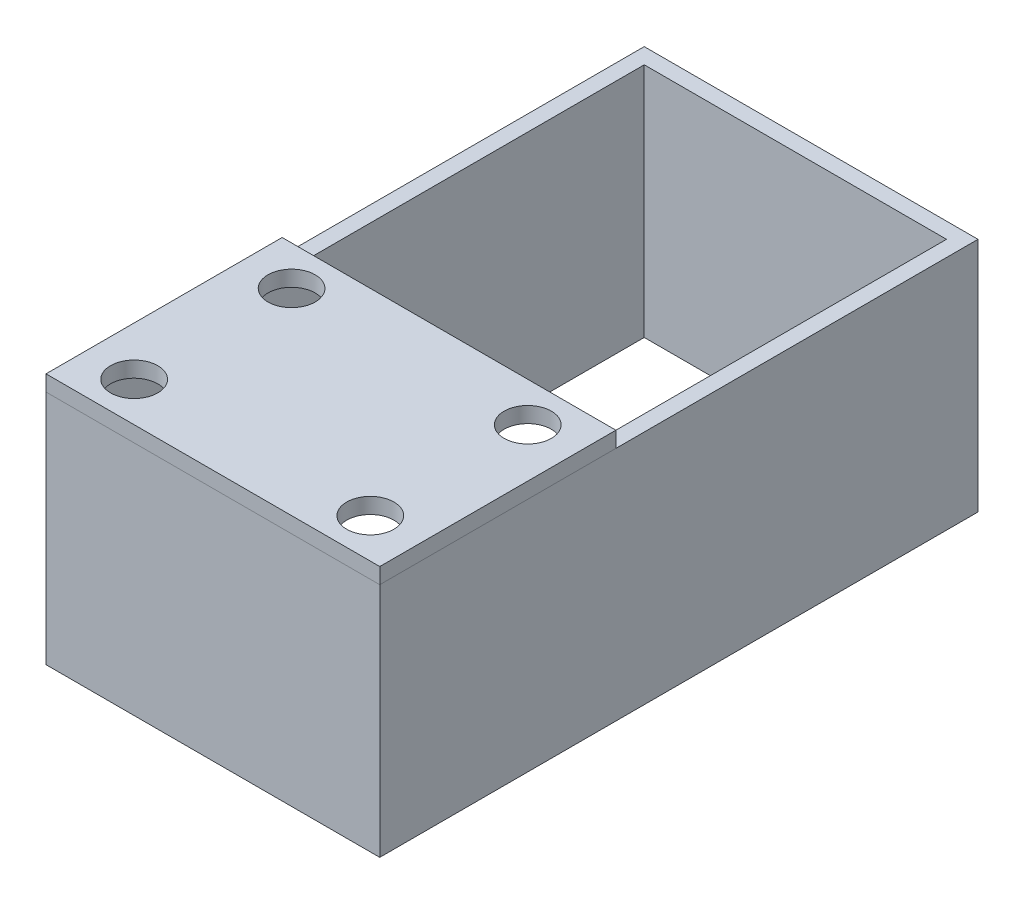
ISO-10303-21;
HEADER;
FILE_DESCRIPTION(('STEP AP214'),'2;1');
FILE_NAME('part.step','',(''),(''),'','','');
FILE_SCHEMA(('AUTOMOTIVE_DESIGN { 1 0 10303 214 1 1 1 1 }'));
ENDSEC;
DATA;
#1=APPLICATION_CONTEXT('core data for automotive mechanical design processes');
#2=APPLICATION_PROTOCOL_DEFINITION('international standard','automotive_design',2000,#1);
#3=PRODUCT_CONTEXT('',#1,'mechanical');
#4=PRODUCT('Part','Part','',(#3));
#5=PRODUCT_RELATED_PRODUCT_CATEGORY('part','',(#4));
#6=PRODUCT_DEFINITION_FORMATION('','',#4);
#7=PRODUCT_DEFINITION_CONTEXT('part definition',#1,'design');
#8=PRODUCT_DEFINITION('design','',#6,#7);
#9=PRODUCT_DEFINITION_SHAPE('','',#8);
#10=(LENGTH_UNIT() NAMED_UNIT(*) SI_UNIT(.MILLI.,.METRE.));
#11=(NAMED_UNIT(*) PLANE_ANGLE_UNIT() SI_UNIT($,.RADIAN.));
#12=(NAMED_UNIT(*) SI_UNIT($,.STERADIAN.) SOLID_ANGLE_UNIT());
#13=UNCERTAINTY_MEASURE_WITH_UNIT(LENGTH_MEASURE(1.E-05),#10,'distance_accuracy_value','');
#14=(GEOMETRIC_REPRESENTATION_CONTEXT(3) GLOBAL_UNCERTAINTY_ASSIGNED_CONTEXT((#13)) GLOBAL_UNIT_ASSIGNED_CONTEXT((#10,
#11,#12)) REPRESENTATION_CONTEXT('',''));
#15=CARTESIAN_POINT('',(0.,0.,0.));
#16=DIRECTION('',(0.,0.,1.));
#17=DIRECTION('',(1.,0.,0.));
#18=AXIS2_PLACEMENT_3D('',#15,#16,#17);
#19=CARTESIAN_POINT('',(0.,32.,0.));
#20=DIRECTION('',(0.,-1.,0.));
#21=DIRECTION('',(0.,0.,-1.));
#22=AXIS2_PLACEMENT_3D('',#19,#20,#21);
#23=PLANE('',#22);
#24=DIRECTION('',(0.,0.,1.));
#25=VECTOR('',#24,1.);
#26=CARTESIAN_POINT('',(-2.,32.,2.));
#27=LINE('',#26,#25);
#28=CARTESIAN_POINT('',(-2.,32.,-28.));
#29=VERTEX_POINT('',#28);
#30=CARTESIAN_POINT('',(-2.,32.,2.));
#31=VERTEX_POINT('',#30);
#32=EDGE_CURVE('E96',#29,#31,#27,.T.);
#33=ORIENTED_EDGE('',*,*,#32,.T.);
#34=DIRECTION('',(1.,0.,0.));
#35=VECTOR('',#34,1.);
#36=CARTESIAN_POINT('',(-2.,32.,2.));
#37=LINE('',#36,#35);
#38=CARTESIAN_POINT('',(40.4,32.,2.));
#39=VERTEX_POINT('',#38);
#40=EDGE_CURVE('E91',#31,#39,#37,.T.);
#41=ORIENTED_EDGE('',*,*,#40,.T.);
#42=DIRECTION('',(0.,0.,-1.));
#43=VECTOR('',#42,1.);
#44=CARTESIAN_POINT('',(40.4,32.,2.));
#45=LINE('',#44,#43);
#46=CARTESIAN_POINT('',(40.4,32.,-28.));
#47=VERTEX_POINT('',#46);
#48=EDGE_CURVE('E94',#39,#47,#45,.T.);
#49=ORIENTED_EDGE('',*,*,#48,.T.);
#50=DIRECTION('',(-1.,0.,0.));
#51=VECTOR('',#50,1.);
#52=CARTESIAN_POINT('',(-2.,32.,-28.));
#53=LINE('',#52,#51);
#54=EDGE_CURVE('E61',#47,#29,#53,.T.);
#55=ORIENTED_EDGE('',*,*,#54,.T.);
#56=EDGE_LOOP('',(#33,#41,#49,#55));
#57=FACE_BOUND('',#56,.T.);
#58=CARTESIAN_POINT('',(4.2,32.,-3.));
#59=DIRECTION('',(0.,1.,0.));
#60=DIRECTION('',(0.,0.,1.));
#61=AXIS2_PLACEMENT_3D('',#58,#59,#60);
#62=CIRCLE('',#61,3.);
#63=CARTESIAN_POINT('',(4.2,32.,0.));
#64=VERTEX_POINT('',#63);
#65=EDGE_CURVE('E111',#64,#64,#62,.T.);
#66=ORIENTED_EDGE('',*,*,#65,.F.);
#67=EDGE_LOOP('',(#66));
#68=FACE_BOUND('',#67,.T.);
#69=CARTESIAN_POINT('',(34.2,32.,-3.));
#70=DIRECTION('',(0.,1.,0.));
#71=DIRECTION('',(0.,0.,-1.));
#72=AXIS2_PLACEMENT_3D('',#69,#70,#71);
#73=CIRCLE('',#72,3.);
#74=CARTESIAN_POINT('',(34.2,32.,-6.00000000000001));
#75=VERTEX_POINT('',#74);
#76=EDGE_CURVE('E126',#75,#75,#73,.T.);
#77=ORIENTED_EDGE('',*,*,#76,.F.);
#78=EDGE_LOOP('',(#77));
#79=FACE_BOUND('',#78,.T.);
#80=CARTESIAN_POINT('',(34.2,32.,-23.));
#81=DIRECTION('',(0.,1.,0.));
#82=DIRECTION('',(0.,0.,1.));
#83=AXIS2_PLACEMENT_3D('',#80,#81,#82);
#84=CIRCLE('',#83,3.);
#85=CARTESIAN_POINT('',(34.2,32.,-20.));
#86=VERTEX_POINT('',#85);
#87=EDGE_CURVE('E132',#86,#86,#84,.T.);
#88=ORIENTED_EDGE('',*,*,#87,.F.);
#89=EDGE_LOOP('',(#88));
#90=FACE_BOUND('',#89,.T.);
#91=CARTESIAN_POINT('',(4.2,32.,-23.));
#92=DIRECTION('',(0.,1.,0.));
#93=DIRECTION('',(0.,0.,-1.));
#94=AXIS2_PLACEMENT_3D('',#91,#92,#93);
#95=CIRCLE('',#94,3.);
#96=CARTESIAN_POINT('',(4.2,32.,-26.));
#97=VERTEX_POINT('',#96);
#98=EDGE_CURVE('E138',#97,#97,#95,.T.);
#99=ORIENTED_EDGE('',*,*,#98,.F.);
#100=EDGE_LOOP('',(#99));
#101=FACE_BOUND('',#100,.T.);
#102=ADVANCED_FACE('F44',(#57,#68,#79,#90,#101),#23,.F.);
#103=CARTESIAN_POINT('',(0.,30.,0.));
#104=DIRECTION('',(0.,-1.,0.));
#105=DIRECTION('',(0.,0.,-1.));
#106=AXIS2_PLACEMENT_3D('',#103,#104,#105);
#107=PLANE('',#106);
#108=CARTESIAN_POINT('',(34.2,30.,-23.));
#109=DIRECTION('',(0.,1.,0.));
#110=DIRECTION('',(0.,0.,1.));
#111=AXIS2_PLACEMENT_3D('',#108,#109,#110);
#112=CIRCLE('',#111,3.);
#113=CARTESIAN_POINT('',(34.2,30.,-20.));
#114=VERTEX_POINT('',#113);
#115=EDGE_CURVE('E135',#114,#114,#112,.T.);
#116=ORIENTED_EDGE('',*,*,#115,.T.);
#117=EDGE_LOOP('',(#116));
#118=FACE_BOUND('',#117,.T.);
#119=CARTESIAN_POINT('',(4.2,30.,-3.));
#120=DIRECTION('',(0.,1.,0.));
#121=DIRECTION('',(0.,0.,1.));
#122=AXIS2_PLACEMENT_3D('',#119,#120,#121);
#123=CIRCLE('',#122,3.);
#124=CARTESIAN_POINT('',(4.2,30.,0.));
#125=VERTEX_POINT('',#124);
#126=EDGE_CURVE('E123',#125,#125,#123,.T.);
#127=ORIENTED_EDGE('',*,*,#126,.T.);
#128=EDGE_LOOP('',(#127));
#129=FACE_BOUND('',#128,.T.);
#130=DIRECTION('',(0.,0.,1.));
#131=VECTOR('',#130,1.);
#132=CARTESIAN_POINT('',(-2.,30.,2.));
#133=LINE('',#132,#131);
#134=CARTESIAN_POINT('',(-2.,30.,-28.));
#135=VERTEX_POINT('',#134);
#136=CARTESIAN_POINT('',(-2.,30.,2.));
#137=VERTEX_POINT('',#136);
#138=EDGE_CURVE('E108',#135,#137,#133,.T.);
#139=ORIENTED_EDGE('',*,*,#138,.F.);
#140=DIRECTION('',(-1.,0.,0.));
#141=VECTOR('',#140,1.);
#142=CARTESIAN_POINT('',(-2.,30.,-28.));
#143=LINE('',#142,#141);
#144=CARTESIAN_POINT('',(40.4,30.,-28.));
#145=VERTEX_POINT('',#144);
#146=EDGE_CURVE('E84',#145,#135,#143,.T.);
#147=ORIENTED_EDGE('',*,*,#146,.F.);
#148=DIRECTION('',(0.,0.,-1.));
#149=VECTOR('',#148,1.);
#150=CARTESIAN_POINT('',(40.4,30.,2.));
#151=LINE('',#150,#149);
#152=CARTESIAN_POINT('',(40.4,30.,2.));
#153=VERTEX_POINT('',#152);
#154=EDGE_CURVE('E78',#153,#145,#151,.T.);
#155=ORIENTED_EDGE('',*,*,#154,.F.);
#156=DIRECTION('',(1.,0.,0.));
#157=VECTOR('',#156,1.);
#158=CARTESIAN_POINT('',(-2.,30.,2.));
#159=LINE('',#158,#157);
#160=EDGE_CURVE('E100',#137,#153,#159,.T.);
#161=ORIENTED_EDGE('',*,*,#160,.F.);
#162=EDGE_LOOP('',(#139,#147,#155,#161));
#163=FACE_BOUND('',#162,.T.);
#164=CARTESIAN_POINT('',(34.2,30.,-3.));
#165=DIRECTION('',(0.,1.,0.));
#166=DIRECTION('',(0.,0.,-1.));
#167=AXIS2_PLACEMENT_3D('',#164,#165,#166);
#168=CIRCLE('',#167,3.);
#169=CARTESIAN_POINT('',(34.2,30.,-6.00000000000001));
#170=VERTEX_POINT('',#169);
#171=EDGE_CURVE('E129',#170,#170,#168,.T.);
#172=ORIENTED_EDGE('',*,*,#171,.T.);
#173=EDGE_LOOP('',(#172));
#174=FACE_BOUND('',#173,.T.);
#175=CARTESIAN_POINT('',(4.2,30.,-23.));
#176=DIRECTION('',(0.,1.,0.));
#177=DIRECTION('',(0.,0.,-1.));
#178=AXIS2_PLACEMENT_3D('',#175,#176,#177);
#179=CIRCLE('',#178,3.);
#180=CARTESIAN_POINT('',(4.2,30.,-26.));
#181=VERTEX_POINT('',#180);
#182=EDGE_CURVE('E141',#181,#181,#179,.T.);
#183=ORIENTED_EDGE('',*,*,#182,.T.);
#184=EDGE_LOOP('',(#183));
#185=FACE_BOUND('',#184,.T.);
#186=ADVANCED_FACE('F119',(#118,#129,#163,#174,#185),#107,.T.);
#187=CARTESIAN_POINT('',(-2.,32.,2.));
#188=DIRECTION('',(1.,0.,0.));
#189=DIRECTION('',(0.,0.,-1.));
#190=AXIS2_PLACEMENT_3D('',#187,#188,#189);
#191=PLANE('',#190);
#192=ORIENTED_EDGE('',*,*,#138,.T.);
#193=DIRECTION('',(0.,-1.,0.));
#194=VECTOR('',#193,1.);
#195=CARTESIAN_POINT('',(-2.,32.,2.));
#196=LINE('',#195,#194);
#197=EDGE_CURVE('E12',#31,#137,#196,.T.);
#198=ORIENTED_EDGE('',*,*,#197,.F.);
#199=ORIENTED_EDGE('',*,*,#32,.F.);
#200=DIRECTION('',(0.,-1.,0.));
#201=VECTOR('',#200,1.);
#202=CARTESIAN_POINT('',(-2.,32.,-28.));
#203=LINE('',#202,#201);
#204=EDGE_CURVE('E104',#29,#135,#203,.T.);
#205=ORIENTED_EDGE('',*,*,#204,.T.);
#206=EDGE_LOOP('',(#192,#198,#199,#205));
#207=FACE_BOUND('',#206,.T.);
#208=ADVANCED_FACE('F46',(#207),#191,.F.);
#209=CARTESIAN_POINT('',(-2.,32.,2.));
#210=DIRECTION('',(0.,0.,-1.));
#211=DIRECTION('',(-1.,0.,0.));
#212=AXIS2_PLACEMENT_3D('',#209,#210,#211);
#213=PLANE('',#212);
#214=ORIENTED_EDGE('',*,*,#160,.T.);
#215=DIRECTION('',(0.,-1.,0.));
#216=VECTOR('',#215,1.);
#217=CARTESIAN_POINT('',(40.4,32.,2.));
#218=LINE('',#217,#216);
#219=EDGE_CURVE('E53',#39,#153,#218,.T.);
#220=ORIENTED_EDGE('',*,*,#219,.F.);
#221=ORIENTED_EDGE('',*,*,#40,.F.);
#222=ORIENTED_EDGE('',*,*,#197,.T.);
#223=EDGE_LOOP('',(#214,#220,#221,#222));
#224=FACE_BOUND('',#223,.T.);
#225=ADVANCED_FACE('F99',(#224),#213,.F.);
#226=CARTESIAN_POINT('',(40.4,32.,2.));
#227=DIRECTION('',(-1.,0.,0.));
#228=DIRECTION('',(0.,0.,1.));
#229=AXIS2_PLACEMENT_3D('',#226,#227,#228);
#230=PLANE('',#229);
#231=ORIENTED_EDGE('',*,*,#154,.T.);
#232=DIRECTION('',(0.,-1.,0.));
#233=VECTOR('',#232,1.);
#234=CARTESIAN_POINT('',(40.4,32.,-28.));
#235=LINE('',#234,#233);
#236=EDGE_CURVE('E101',#47,#145,#235,.T.);
#237=ORIENTED_EDGE('',*,*,#236,.F.);
#238=ORIENTED_EDGE('',*,*,#48,.F.);
#239=ORIENTED_EDGE('',*,*,#219,.T.);
#240=EDGE_LOOP('',(#231,#237,#238,#239));
#241=FACE_BOUND('',#240,.T.);
#242=ADVANCED_FACE('F102',(#241),#230,.F.);
#243=CARTESIAN_POINT('',(-2.,32.,-28.));
#244=DIRECTION('',(0.,0.,1.));
#245=DIRECTION('',(1.,0.,0.));
#246=AXIS2_PLACEMENT_3D('',#243,#244,#245);
#247=PLANE('',#246);
#248=ORIENTED_EDGE('',*,*,#146,.T.);
#249=ORIENTED_EDGE('',*,*,#204,.F.);
#250=ORIENTED_EDGE('',*,*,#54,.F.);
#251=ORIENTED_EDGE('',*,*,#236,.T.);
#252=EDGE_LOOP('',(#248,#249,#250,#251));
#253=FACE_BOUND('',#252,.T.);
#254=ADVANCED_FACE('F116',(#253),#247,.F.);
#255=CARTESIAN_POINT('',(4.2,32.,-3.));
#256=DIRECTION('',(0.,-1.,0.));
#257=DIRECTION('',(0.,0.,-1.));
#258=AXIS2_PLACEMENT_3D('',#255,#256,#257);
#259=CYLINDRICAL_SURFACE('',#258,3.);
#260=ORIENTED_EDGE('',*,*,#65,.T.);
#261=EDGE_LOOP('',(#260));
#262=FACE_BOUND('',#261,.T.);
#263=ORIENTED_EDGE('',*,*,#126,.F.);
#264=EDGE_LOOP('',(#263));
#265=FACE_BOUND('',#264,.T.);
#266=ADVANCED_FACE('F158',(#262,#265),#259,.F.);
#267=CARTESIAN_POINT('',(34.2,32.,-3.));
#268=DIRECTION('',(0.,-1.,0.));
#269=DIRECTION('',(0.,0.,-1.));
#270=AXIS2_PLACEMENT_3D('',#267,#268,#269);
#271=CYLINDRICAL_SURFACE('',#270,3.);
#272=ORIENTED_EDGE('',*,*,#76,.T.);
#273=EDGE_LOOP('',(#272));
#274=FACE_BOUND('',#273,.T.);
#275=ORIENTED_EDGE('',*,*,#171,.F.);
#276=EDGE_LOOP('',(#275));
#277=FACE_BOUND('',#276,.T.);
#278=ADVANCED_FACE('F204',(#274,#277),#271,.F.);
#279=CARTESIAN_POINT('',(34.2,32.,-23.));
#280=DIRECTION('',(0.,-1.,0.));
#281=DIRECTION('',(0.,0.,-1.));
#282=AXIS2_PLACEMENT_3D('',#279,#280,#281);
#283=CYLINDRICAL_SURFACE('',#282,3.);
#284=ORIENTED_EDGE('',*,*,#87,.T.);
#285=EDGE_LOOP('',(#284));
#286=FACE_BOUND('',#285,.T.);
#287=ORIENTED_EDGE('',*,*,#115,.F.);
#288=EDGE_LOOP('',(#287));
#289=FACE_BOUND('',#288,.T.);
#290=ADVANCED_FACE('F212',(#286,#289),#283,.F.);
#291=CARTESIAN_POINT('',(4.2,32.,-23.));
#292=DIRECTION('',(0.,-1.,0.));
#293=DIRECTION('',(0.,0.,-1.));
#294=AXIS2_PLACEMENT_3D('',#291,#292,#293);
#295=CYLINDRICAL_SURFACE('',#294,3.);
#296=ORIENTED_EDGE('',*,*,#98,.T.);
#297=EDGE_LOOP('',(#296));
#298=FACE_BOUND('',#297,.T.);
#299=ORIENTED_EDGE('',*,*,#182,.F.);
#300=EDGE_LOOP('',(#299));
#301=FACE_BOUND('',#300,.T.);
#302=ADVANCED_FACE('F147',(#298,#301),#295,.F.);
#303=CLOSED_SHELL('',(#102,#186,#208,#225,#242,#254,#266,#278,#290,#302));
#304=MANIFOLD_SOLID_BREP('B2',#303);
#305=CARTESIAN_POINT('',(0.,30.,0.));
#306=DIRECTION('',(0.,1.,0.));
#307=DIRECTION('',(0.,0.,1.));
#308=AXIS2_PLACEMENT_3D('',#305,#306,#307);
#309=PLANE('',#308);
#310=DIRECTION('',(1.,0.,0.));
#311=VECTOR('',#310,1.);
#312=CARTESIAN_POINT('',(-2.,30.,2.));
#313=LINE('',#312,#311);
#314=CARTESIAN_POINT('',(-2.,30.,2.));
#315=VERTEX_POINT('',#314);
#316=CARTESIAN_POINT('',(40.4,30.,2.));
#317=VERTEX_POINT('',#316);
#318=EDGE_CURVE('E352',#315,#317,#313,.T.);
#319=ORIENTED_EDGE('',*,*,#318,.T.);
#320=DIRECTION('',(0.,0.,-1.));
#321=VECTOR('',#320,1.);
#322=CARTESIAN_POINT('',(40.4,30.,2.));
#323=LINE('',#322,#321);
#324=CARTESIAN_POINT('',(40.4,30.,-74.));
#325=VERTEX_POINT('',#324);
#326=EDGE_CURVE('E355',#317,#325,#323,.T.);
#327=ORIENTED_EDGE('',*,*,#326,.T.);
#328=DIRECTION('',(-1.,0.,0.));
#329=VECTOR('',#328,1.);
#330=CARTESIAN_POINT('',(-2.,30.,-74.));
#331=LINE('',#330,#329);
#332=CARTESIAN_POINT('',(-2.,30.,-74.));
#333=VERTEX_POINT('',#332);
#334=EDGE_CURVE('E358',#325,#333,#331,.T.);
#335=ORIENTED_EDGE('',*,*,#334,.T.);
#336=DIRECTION('',(0.,0.,1.));
#337=VECTOR('',#336,1.);
#338=CARTESIAN_POINT('',(-2.,30.,2.));
#339=LINE('',#338,#337);
#340=EDGE_CURVE('E360',#333,#315,#339,.T.);
#341=ORIENTED_EDGE('',*,*,#340,.T.);
#342=EDGE_LOOP('',(#319,#327,#335,#341));
#343=FACE_BOUND('',#342,.T.);
#344=DIRECTION('',(1.,0.,0.));
#345=VECTOR('',#344,1.);
#346=CARTESIAN_POINT('',(0.,30.,0.));
#347=LINE('',#346,#345);
#348=CARTESIAN_POINT('',(0.,30.,0.));
#349=VERTEX_POINT('',#348);
#350=CARTESIAN_POINT('',(38.4,30.,0.));
#351=VERTEX_POINT('',#350);
#352=EDGE_CURVE('E324',#349,#351,#347,.T.);
#353=ORIENTED_EDGE('',*,*,#352,.F.);
#354=DIRECTION('',(0.,0.,1.));
#355=VECTOR('',#354,1.);
#356=CARTESIAN_POINT('',(0.,30.,0.));
#357=LINE('',#356,#355);
#358=CARTESIAN_POINT('',(0.,30.,-72.));
#359=VERTEX_POINT('',#358);
#360=EDGE_CURVE('E316',#359,#349,#357,.T.);
#361=ORIENTED_EDGE('',*,*,#360,.F.);
#362=DIRECTION('',(-1.,0.,0.));
#363=VECTOR('',#362,1.);
#364=CARTESIAN_POINT('',(0.,30.,-72.));
#365=LINE('',#364,#363);
#366=CARTESIAN_POINT('',(38.4,30.,-72.));
#367=VERTEX_POINT('',#366);
#368=EDGE_CURVE('E338',#367,#359,#365,.T.);
#369=ORIENTED_EDGE('',*,*,#368,.F.);
#370=DIRECTION('',(0.,0.,-1.));
#371=VECTOR('',#370,1.);
#372=CARTESIAN_POINT('',(38.4,30.,0.));
#373=LINE('',#372,#371);
#374=EDGE_CURVE('E336',#351,#367,#373,.T.);
#375=ORIENTED_EDGE('',*,*,#374,.F.);
#376=EDGE_LOOP('',(#353,#361,#369,#375));
#377=FACE_BOUND('',#376,.T.);
#378=ADVANCED_FACE('F251',(#343,#377),#309,.T.);
#379=CARTESIAN_POINT('',(0.,0.,0.));
#380=DIRECTION('',(0.,1.,0.));
#381=DIRECTION('',(0.,0.,1.));
#382=AXIS2_PLACEMENT_3D('',#379,#380,#381);
#383=PLANE('',#382);
#384=DIRECTION('',(1.,0.,0.));
#385=VECTOR('',#384,1.);
#386=CARTESIAN_POINT('',(-2.,0.,2.));
#387=LINE('',#386,#385);
#388=CARTESIAN_POINT('',(-2.,0.,2.));
#389=VERTEX_POINT('',#388);
#390=CARTESIAN_POINT('',(40.4,0.,2.));
#391=VERTEX_POINT('',#390);
#392=EDGE_CURVE('E332',#389,#391,#387,.T.);
#393=ORIENTED_EDGE('',*,*,#392,.F.);
#394=DIRECTION('',(0.,0.,1.));
#395=VECTOR('',#394,1.);
#396=CARTESIAN_POINT('',(-2.,0.,2.));
#397=LINE('',#396,#395);
#398=CARTESIAN_POINT('',(-2.,0.,-74.));
#399=VERTEX_POINT('',#398);
#400=EDGE_CURVE('E356',#399,#389,#397,.T.);
#401=ORIENTED_EDGE('',*,*,#400,.F.);
#402=DIRECTION('',(-1.,0.,0.));
#403=VECTOR('',#402,1.);
#404=CARTESIAN_POINT('',(-2.,0.,-74.));
#405=LINE('',#404,#403);
#406=CARTESIAN_POINT('',(40.4,0.,-74.));
#407=VERTEX_POINT('',#406);
#408=EDGE_CURVE('E367',#407,#399,#405,.T.);
#409=ORIENTED_EDGE('',*,*,#408,.F.);
#410=DIRECTION('',(0.,0.,-1.));
#411=VECTOR('',#410,1.);
#412=CARTESIAN_POINT('',(40.4,0.,2.));
#413=LINE('',#412,#411);
#414=EDGE_CURVE('E365',#391,#407,#413,.T.);
#415=ORIENTED_EDGE('',*,*,#414,.F.);
#416=EDGE_LOOP('',(#393,#401,#409,#415));
#417=FACE_BOUND('',#416,.T.);
#418=DIRECTION('',(0.,0.,1.));
#419=VECTOR('',#418,1.);
#420=CARTESIAN_POINT('',(0.,0.,0.));
#421=LINE('',#420,#419);
#422=CARTESIAN_POINT('',(0.,0.,-72.));
#423=VERTEX_POINT('',#422);
#424=CARTESIAN_POINT('',(0.,0.,0.));
#425=VERTEX_POINT('',#424);
#426=EDGE_CURVE('E274',#423,#425,#421,.T.);
#427=ORIENTED_EDGE('',*,*,#426,.T.);
#428=DIRECTION('',(1.,0.,0.));
#429=VECTOR('',#428,1.);
#430=CARTESIAN_POINT('',(0.,0.,0.));
#431=LINE('',#430,#429);
#432=CARTESIAN_POINT('',(38.4,0.,0.));
#433=VERTEX_POINT('',#432);
#434=EDGE_CURVE('E331',#425,#433,#431,.T.);
#435=ORIENTED_EDGE('',*,*,#434,.T.);
#436=DIRECTION('',(0.,0.,-1.));
#437=VECTOR('',#436,1.);
#438=CARTESIAN_POINT('',(38.4,0.,0.));
#439=LINE('',#438,#437);
#440=CARTESIAN_POINT('',(38.4,0.,-72.));
#441=VERTEX_POINT('',#440);
#442=EDGE_CURVE('E344',#433,#441,#439,.T.);
#443=ORIENTED_EDGE('',*,*,#442,.T.);
#444=DIRECTION('',(-1.,0.,0.));
#445=VECTOR('',#444,1.);
#446=CARTESIAN_POINT('',(0.,0.,-72.));
#447=LINE('',#446,#445);
#448=EDGE_CURVE('E325',#441,#423,#447,.T.);
#449=ORIENTED_EDGE('',*,*,#448,.T.);
#450=EDGE_LOOP('',(#427,#435,#443,#449));
#451=FACE_BOUND('',#450,.T.);
#452=ADVANCED_FACE('F385',(#417,#451),#383,.F.);
#453=CARTESIAN_POINT('',(-2.,30.,2.));
#454=DIRECTION('',(0.,0.,-1.));
#455=DIRECTION('',(-1.,0.,0.));
#456=AXIS2_PLACEMENT_3D('',#453,#454,#455);
#457=PLANE('',#456);
#458=ORIENTED_EDGE('',*,*,#392,.T.);
#459=DIRECTION('',(0.,-1.,0.));
#460=VECTOR('',#459,1.);
#461=CARTESIAN_POINT('',(40.4,30.,2.));
#462=LINE('',#461,#460);
#463=EDGE_CURVE('E42',#317,#391,#462,.T.);
#464=ORIENTED_EDGE('',*,*,#463,.F.);
#465=ORIENTED_EDGE('',*,*,#318,.F.);
#466=DIRECTION('',(0.,-1.,0.));
#467=VECTOR('',#466,1.);
#468=CARTESIAN_POINT('',(-2.,30.,2.));
#469=LINE('',#468,#467);
#470=EDGE_CURVE('E362',#315,#389,#469,.T.);
#471=ORIENTED_EDGE('',*,*,#470,.T.);
#472=EDGE_LOOP('',(#458,#464,#465,#471));
#473=FACE_BOUND('',#472,.T.);
#474=ADVANCED_FACE('F253',(#473),#457,.F.);
#475=CARTESIAN_POINT('',(40.4,30.,2.));
#476=DIRECTION('',(-1.,0.,0.));
#477=DIRECTION('',(0.,0.,1.));
#478=AXIS2_PLACEMENT_3D('',#475,#476,#477);
#479=PLANE('',#478);
#480=ORIENTED_EDGE('',*,*,#414,.T.);
#481=DIRECTION('',(0.,-1.,0.));
#482=VECTOR('',#481,1.);
#483=CARTESIAN_POINT('',(40.4,30.,-74.));
#484=LINE('',#483,#482);
#485=EDGE_CURVE('E259',#325,#407,#484,.T.);
#486=ORIENTED_EDGE('',*,*,#485,.F.);
#487=ORIENTED_EDGE('',*,*,#326,.F.);
#488=ORIENTED_EDGE('',*,*,#463,.T.);
#489=EDGE_LOOP('',(#480,#486,#487,#488));
#490=FACE_BOUND('',#489,.T.);
#491=ADVANCED_FACE('F395',(#490),#479,.F.);
#492=CARTESIAN_POINT('',(-2.,30.,-74.));
#493=DIRECTION('',(0.,0.,1.));
#494=DIRECTION('',(1.,0.,0.));
#495=AXIS2_PLACEMENT_3D('',#492,#493,#494);
#496=PLANE('',#495);
#497=ORIENTED_EDGE('',*,*,#408,.T.);
#498=DIRECTION('',(0.,-1.,0.));
#499=VECTOR('',#498,1.);
#500=CARTESIAN_POINT('',(-2.,30.,-74.));
#501=LINE('',#500,#499);
#502=EDGE_CURVE('E372',#333,#399,#501,.T.);
#503=ORIENTED_EDGE('',*,*,#502,.F.);
#504=ORIENTED_EDGE('',*,*,#334,.F.);
#505=ORIENTED_EDGE('',*,*,#485,.T.);
#506=EDGE_LOOP('',(#497,#503,#504,#505));
#507=FACE_BOUND('',#506,.T.);
#508=ADVANCED_FACE('F379',(#507),#496,.F.);
#509=CARTESIAN_POINT('',(-2.,30.,2.));
#510=DIRECTION('',(1.,0.,0.));
#511=DIRECTION('',(0.,0.,-1.));
#512=AXIS2_PLACEMENT_3D('',#509,#510,#511);
#513=PLANE('',#512);
#514=ORIENTED_EDGE('',*,*,#400,.T.);
#515=ORIENTED_EDGE('',*,*,#470,.F.);
#516=ORIENTED_EDGE('',*,*,#340,.F.);
#517=ORIENTED_EDGE('',*,*,#502,.T.);
#518=EDGE_LOOP('',(#514,#515,#516,#517));
#519=FACE_BOUND('',#518,.T.);
#520=ADVANCED_FACE('F389',(#519),#513,.F.);
#521=CARTESIAN_POINT('',(0.,30.,0.));
#522=DIRECTION('',(1.,0.,0.));
#523=DIRECTION('',(0.,0.,-1.));
#524=AXIS2_PLACEMENT_3D('',#521,#522,#523);
#525=PLANE('',#524);
#526=ORIENTED_EDGE('',*,*,#426,.F.);
#527=DIRECTION('',(0.,-1.,0.));
#528=VECTOR('',#527,1.);
#529=CARTESIAN_POINT('',(0.,30.,-72.));
#530=LINE('',#529,#528);
#531=EDGE_CURVE('E320',#359,#423,#530,.T.);
#532=ORIENTED_EDGE('',*,*,#531,.F.);
#533=ORIENTED_EDGE('',*,*,#360,.T.);
#534=DIRECTION('',(0.,-1.,0.));
#535=VECTOR('',#534,1.);
#536=CARTESIAN_POINT('',(0.,30.,0.));
#537=LINE('',#536,#535);
#538=EDGE_CURVE('E319',#349,#425,#537,.T.);
#539=ORIENTED_EDGE('',*,*,#538,.T.);
#540=EDGE_LOOP('',(#526,#532,#533,#539));
#541=FACE_BOUND('',#540,.T.);
#542=ADVANCED_FACE('F318',(#541),#525,.T.);
#543=CARTESIAN_POINT('',(0.,30.,0.));
#544=DIRECTION('',(0.,0.,-1.));
#545=DIRECTION('',(-1.,0.,0.));
#546=AXIS2_PLACEMENT_3D('',#543,#544,#545);
#547=PLANE('',#546);
#548=ORIENTED_EDGE('',*,*,#434,.F.);
#549=ORIENTED_EDGE('',*,*,#538,.F.);
#550=ORIENTED_EDGE('',*,*,#352,.T.);
#551=DIRECTION('',(0.,-1.,0.));
#552=VECTOR('',#551,1.);
#553=CARTESIAN_POINT('',(38.4,30.,0.));
#554=LINE('',#553,#552);
#555=EDGE_CURVE('E333',#351,#433,#554,.T.);
#556=ORIENTED_EDGE('',*,*,#555,.T.);
#557=EDGE_LOOP('',(#548,#549,#550,#556));
#558=FACE_BOUND('',#557,.T.);
#559=ADVANCED_FACE('F328',(#558),#547,.T.);
#560=CARTESIAN_POINT('',(38.4,30.,0.));
#561=DIRECTION('',(-1.,0.,0.));
#562=DIRECTION('',(0.,0.,1.));
#563=AXIS2_PLACEMENT_3D('',#560,#561,#562);
#564=PLANE('',#563);
#565=ORIENTED_EDGE('',*,*,#442,.F.);
#566=ORIENTED_EDGE('',*,*,#555,.F.);
#567=ORIENTED_EDGE('',*,*,#374,.T.);
#568=DIRECTION('',(0.,-1.,0.));
#569=VECTOR('',#568,1.);
#570=CARTESIAN_POINT('',(38.4,30.,-72.));
#571=LINE('',#570,#569);
#572=EDGE_CURVE('E266',#367,#441,#571,.T.);
#573=ORIENTED_EDGE('',*,*,#572,.T.);
#574=EDGE_LOOP('',(#565,#566,#567,#573));
#575=FACE_BOUND('',#574,.T.);
#576=ADVANCED_FACE('F418',(#575),#564,.T.);
#577=CARTESIAN_POINT('',(0.,30.,-72.));
#578=DIRECTION('',(0.,0.,1.));
#579=DIRECTION('',(1.,0.,0.));
#580=AXIS2_PLACEMENT_3D('',#577,#578,#579);
#581=PLANE('',#580);
#582=ORIENTED_EDGE('',*,*,#448,.F.);
#583=ORIENTED_EDGE('',*,*,#572,.F.);
#584=ORIENTED_EDGE('',*,*,#368,.T.);
#585=ORIENTED_EDGE('',*,*,#531,.T.);
#586=EDGE_LOOP('',(#582,#583,#584,#585));
#587=FACE_BOUND('',#586,.T.);
#588=ADVANCED_FACE('F422',(#587),#581,.T.);
#589=CLOSED_SHELL('',(#378,#452,#474,#491,#508,#520,#542,#559,#576,#588));
#590=MANIFOLD_SOLID_BREP('B6',#589);
#591=ADVANCED_BREP_SHAPE_REPRESENTATION('',(#18,#304,#590),#14);
#592=SHAPE_DEFINITION_REPRESENTATION(#9,#591);
ENDSEC;
END-ISO-10303-21;
